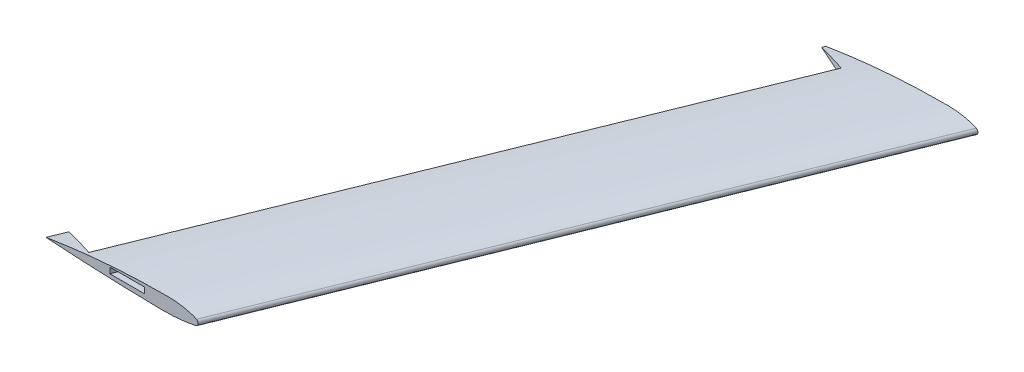
ISO-10303-21;
HEADER;
FILE_DESCRIPTION(('STEP AP214'),'2;1');
FILE_NAME('part.step','',(''),(''),'','','');
FILE_SCHEMA(('AUTOMOTIVE_DESIGN { 1 0 10303 214 1 1 1 1 }'));
ENDSEC;
DATA;
#1=APPLICATION_CONTEXT('core data for automotive mechanical design processes');
#2=APPLICATION_PROTOCOL_DEFINITION('international standard','automotive_design',2000,#1);
#3=PRODUCT_CONTEXT('',#1,'mechanical');
#4=PRODUCT('Part','Part','',(#3));
#5=PRODUCT_RELATED_PRODUCT_CATEGORY('part','',(#4));
#6=PRODUCT_DEFINITION_FORMATION('','',#4);
#7=PRODUCT_DEFINITION_CONTEXT('part definition',#1,'design');
#8=PRODUCT_DEFINITION('design','',#6,#7);
#9=PRODUCT_DEFINITION_SHAPE('','',#8);
#10=(LENGTH_UNIT() NAMED_UNIT(*) SI_UNIT(.MILLI.,.METRE.));
#11=(NAMED_UNIT(*) PLANE_ANGLE_UNIT() SI_UNIT($,.RADIAN.));
#12=(NAMED_UNIT(*) SI_UNIT($,.STERADIAN.) SOLID_ANGLE_UNIT());
#13=UNCERTAINTY_MEASURE_WITH_UNIT(LENGTH_MEASURE(1.E-05),#10,'distance_accuracy_value','');
#14=(GEOMETRIC_REPRESENTATION_CONTEXT(3) GLOBAL_UNCERTAINTY_ASSIGNED_CONTEXT((#13)) GLOBAL_UNIT_ASSIGNED_CONTEXT((#10,
#11,#12)) REPRESENTATION_CONTEXT('',''));
#15=CARTESIAN_POINT('',(0.,0.,0.));
#16=DIRECTION('',(0.,0.,1.));
#17=DIRECTION('',(1.,0.,0.));
#18=AXIS2_PLACEMENT_3D('',#15,#16,#17);
#19=CARTESIAN_POINT('',(-405.020409697345,-106.311961463395,1092.2));
#20=DIRECTION('',(0.,0.,-1.));
#21=DIRECTION('',(1.,0.,0.));
#22=AXIS2_PLACEMENT_3D('',#19,#20,#21);
#23=PLANE('',#22);
#24=DIRECTION('',(0.,1.,0.));
#25=VECTOR('',#24,1.);
#26=CARTESIAN_POINT('',(-520.129656428513,14.097,1092.2));
#27=LINE('',#26,#25);
#28=CARTESIAN_POINT('',(-520.129656428513,14.097,1092.2));
#29=VERTEX_POINT('',#28);
#30=CARTESIAN_POINT('',(-520.129656428513,25.527,1092.2));
#31=VERTEX_POINT('',#30);
#32=EDGE_CURVE('E430',#29,#31,#27,.T.);
#33=ORIENTED_EDGE('',*,*,#32,.T.);
#34=DIRECTION('',(-1.,0.,0.));
#35=VECTOR('',#34,1.);
#36=CARTESIAN_POINT('',(-520.129656428513,25.527,1092.2));
#37=LINE('',#36,#35);
#38=CARTESIAN_POINT('',(-451.642700268486,25.527,1092.2));
#39=VERTEX_POINT('',#38);
#40=EDGE_CURVE('E443',#39,#31,#37,.T.);
#41=ORIENTED_EDGE('',*,*,#40,.F.);
#42=DIRECTION('',(0.,1.,0.));
#43=VECTOR('',#42,1.);
#44=CARTESIAN_POINT('',(-451.642700268486,14.097,1092.2));
#45=LINE('',#44,#43);
#46=CARTESIAN_POINT('',(-451.642700268486,14.097,1092.2));
#47=VERTEX_POINT('',#46);
#48=EDGE_CURVE('E416',#47,#39,#45,.T.);
#49=ORIENTED_EDGE('',*,*,#48,.F.);
#50=DIRECTION('',(-1.,0.,0.));
#51=VECTOR('',#50,1.);
#52=CARTESIAN_POINT('',(-520.129656428513,14.097,1092.2));
#53=LINE('',#52,#51);
#54=EDGE_CURVE('E450',#47,#29,#53,.T.);
#55=ORIENTED_EDGE('',*,*,#54,.T.);
#56=EDGE_LOOP('',(#33,#41,#49,#55));
#57=FACE_BOUND('',#56,.T.);
#58=CARTESIAN_POINT('',(-375.48765869508,-20.0425810696087,1092.2));
#59=DIRECTION('',(0.,0.,1.));
#60=DIRECTION('',(1.,0.,0.));
#61=AXIS2_PLACEMENT_3D('',#58,#59,#60);
#62=ELLIPSE('',#61,52.0544729369289,48.2640668651051);
#63=CARTESIAN_POINT('',(-349.656597619421,21.8600320467453,1092.2));
#64=VERTEX_POINT('',#63);
#65=CARTESIAN_POINT('',(-359.739577110439,25.9598126997249,1092.2));
#66=VERTEX_POINT('',#65);
#67=EDGE_CURVE('E166',#64,#66,#62,.T.);
#68=ORIENTED_EDGE('',*,*,#67,.T.);
#69=CARTESIAN_POINT('',(-405.020409697345,-106.311961463395,1092.2));
#70=DIRECTION('',(0.,0.,1.));
#71=DIRECTION('',(1.,0.,0.));
#72=AXIS2_PLACEMENT_3D('',#69,#70,#71);
#73=ELLIPSE('',#72,149.673460972889,138.774816471194);
#74=CARTESIAN_POINT('',(-404.297033786117,32.4612342366972,1092.2));
#75=VERTEX_POINT('',#74);
#76=EDGE_CURVE('E335',#66,#75,#73,.T.);
#77=ORIENTED_EDGE('',*,*,#76,.T.);
#78=CARTESIAN_POINT('',(-410.785047423502,-1212.20612642052,1092.2));
#79=DIRECTION('',(0.,0.,1.));
#80=DIRECTION('',(1.,0.,0.));
#81=AXIS2_PLACEMENT_3D('',#78,#79,#80);
#82=ELLIPSE('',#81,1342.43267001044,1244.68189747666);
#83=CARTESIAN_POINT('',(-645.570996369339,13.291406219897,1092.2));
#84=VERTEX_POINT('',#83);
#85=EDGE_CURVE('E411',#75,#84,#82,.T.);
#86=ORIENTED_EDGE('',*,*,#85,.T.);
#87=CARTESIAN_POINT('',(-375.097020059196,2847.58690276896,1092.2));
#88=DIRECTION('',(0.,0.,1.));
#89=DIRECTION('',(0.999969321883776,-0.00783296184731892,0.));
#90=AXIS2_PLACEMENT_3D('',#87,#88,#89);
#91=ELLIPSE('',#90,3398.12195786294,2843.92729443399);
#92=CARTESIAN_POINT('',(-416.997552055502,3.94800461409561,1092.2));
#93=VERTEX_POINT('',#92);
#94=EDGE_CURVE('E156',#84,#93,#91,.T.);
#95=ORIENTED_EDGE('',*,*,#94,.T.);
#96=CARTESIAN_POINT('',(-413.099836229002,268.470372395264,1092.2));
#97=DIRECTION('',(0.,0.,1.));
#98=DIRECTION('',(1.,0.,0.));
#99=AXIS2_PLACEMENT_3D('',#96,#97,#98);
#100=ELLIPSE('',#99,285.323187882039,264.547053137752);
#101=CARTESIAN_POINT('',(-351.578401419046,10.1458611123359,1092.2));
#102=VERTEX_POINT('',#101);
#103=EDGE_CURVE('E404',#93,#102,#100,.T.);
#104=ORIENTED_EDGE('',*,*,#103,.T.);
#105=CARTESIAN_POINT('',(-353.055165161637,16.3468185510675,1092.2));
#106=DIRECTION('',(0.,0.,1.));
#107=DIRECTION('',(-1.,0.,0.));
#108=AXIS2_PLACEMENT_3D('',#105,#106,#107);
#109=ELLIPSE('',#108,6.84869408304132,6.35);
#110=EDGE_CURVE('E352',#64,#102,#109,.F.);
#111=ORIENTED_EDGE('',*,*,#110,.F.);
#112=EDGE_LOOP('',(#68,#77,#86,#95,#104,#111));
#113=FACE_BOUND('',#112,.T.);
#114=ADVANCED_FACE('F38',(#57,#113),#23,.F.);
#115=CARTESIAN_POINT('',(36.2563303026578,-106.311961463395,0.));
#116=DIRECTION('',(0.,0.,-1.));
#117=DIRECTION('',(1.,0.,0.));
#118=AXIS2_PLACEMENT_3D('',#115,#116,#117);
#119=PLANE('',#118);
#120=DIRECTION('',(1.,0.,0.));
#121=VECTOR('',#120,1.);
#122=CARTESIAN_POINT('',(-10.365256411322,14.097,0.));
#123=LINE('',#122,#121);
#124=CARTESIAN_POINT('',(-78.8522125713488,14.097,0.));
#125=VERTEX_POINT('',#124);
#126=CARTESIAN_POINT('',(-10.365256411322,14.097,0.));
#127=VERTEX_POINT('',#126);
#128=EDGE_CURVE('E434',#125,#127,#123,.T.);
#129=ORIENTED_EDGE('',*,*,#128,.T.);
#130=DIRECTION('',(0.,1.,0.));
#131=VECTOR('',#130,1.);
#132=CARTESIAN_POINT('',(-10.365256411322,14.097,0.));
#133=LINE('',#132,#131);
#134=CARTESIAN_POINT('',(-10.365256411322,25.527,0.));
#135=VERTEX_POINT('',#134);
#136=EDGE_CURVE('E418',#127,#135,#133,.T.);
#137=ORIENTED_EDGE('',*,*,#136,.T.);
#138=DIRECTION('',(1.,0.,0.));
#139=VECTOR('',#138,1.);
#140=CARTESIAN_POINT('',(-10.365256411322,25.527,0.));
#141=LINE('',#140,#139);
#142=CARTESIAN_POINT('',(-78.8522125713488,25.527,0.));
#143=VERTEX_POINT('',#142);
#144=EDGE_CURVE('E446',#143,#135,#141,.T.);
#145=ORIENTED_EDGE('',*,*,#144,.F.);
#146=DIRECTION('',(0.,1.,0.));
#147=VECTOR('',#146,1.);
#148=CARTESIAN_POINT('',(-78.8522125713488,14.097,0.));
#149=LINE('',#148,#147);
#150=EDGE_CURVE('E424',#125,#143,#149,.T.);
#151=ORIENTED_EDGE('',*,*,#150,.F.);
#152=EDGE_LOOP('',(#129,#137,#145,#151));
#153=FACE_BOUND('',#152,.T.);
#154=CARTESIAN_POINT('',(28.1769037710007,268.470372395264,0.));
#155=DIRECTION('',(0.,0.,1.));
#156=DIRECTION('',(1.,0.,0.));
#157=AXIS2_PLACEMENT_3D('',#154,#155,#156);
#158=ELLIPSE('',#157,285.323187882039,264.547053137752);
#159=CARTESIAN_POINT('',(24.2791879445013,3.9480046140925,0.));
#160=VERTEX_POINT('',#159);
#161=CARTESIAN_POINT('',(89.69834003348,10.1458541037797,0.));
#162=VERTEX_POINT('',#161);
#163=EDGE_CURVE('E366',#160,#162,#158,.T.);
#164=ORIENTED_EDGE('',*,*,#163,.F.);
#165=CARTESIAN_POINT('',(66.1797199408075,2847.58690276896,0.));
#166=DIRECTION('',(0.,0.,1.));
#167=DIRECTION('',(0.999969321883776,-0.00783296184731892,0.));
#168=AXIS2_PLACEMENT_3D('',#165,#166,#167);
#169=ELLIPSE('',#168,3398.12195786294,2843.927294434);
#170=CARTESIAN_POINT('',(-204.294256369335,13.2914062198952,0.));
#171=VERTEX_POINT('',#170);
#172=EDGE_CURVE('E370',#171,#160,#169,.T.);
#173=ORIENTED_EDGE('',*,*,#172,.F.);
#174=CARTESIAN_POINT('',(30.4916925765012,-1212.20612642052,0.));
#175=DIRECTION('',(0.,0.,1.));
#176=DIRECTION('',(1.,0.,0.));
#177=AXIS2_PLACEMENT_3D('',#174,#175,#176);
#178=ELLIPSE('',#177,1342.43267001044,1244.68189747666);
#179=CARTESIAN_POINT('',(36.9797062138845,32.4612342366976,0.));
#180=VERTEX_POINT('',#179);
#181=EDGE_CURVE('E185',#180,#171,#178,.T.);
#182=ORIENTED_EDGE('',*,*,#181,.F.);
#183=CARTESIAN_POINT('',(36.2563303026578,-106.311961463395,0.));
#184=DIRECTION('',(0.,0.,1.));
#185=DIRECTION('',(1.,0.,0.));
#186=AXIS2_PLACEMENT_3D('',#183,#184,#185);
#187=ELLIPSE('',#186,149.673460972889,138.774816471194);
#188=CARTESIAN_POINT('',(81.5371628895645,25.9598126997247,0.));
#189=VERTEX_POINT('',#188);
#190=EDGE_CURVE('E164',#189,#180,#187,.T.);
#191=ORIENTED_EDGE('',*,*,#190,.F.);
#192=CARTESIAN_POINT('',(65.7890813049233,-20.042581069609,0.));
#193=DIRECTION('',(0.,0.,1.));
#194=DIRECTION('',(1.,0.,0.));
#195=AXIS2_PLACEMENT_3D('',#192,#193,#194);
#196=ELLIPSE('',#195,52.0544729369298,48.264066865105);
#197=CARTESIAN_POINT('',(91.6201507247673,21.8600477382464,0.));
#198=VERTEX_POINT('',#197);
#199=EDGE_CURVE('E345',#198,#189,#196,.T.);
#200=ORIENTED_EDGE('',*,*,#199,.F.);
#201=CARTESIAN_POINT('',(88.2215748383678,16.3468185510675,0.));
#202=DIRECTION('',(0.,0.,1.));
#203=DIRECTION('',(-1.,0.,0.));
#204=AXIS2_PLACEMENT_3D('',#201,#202,#203);
#205=ELLIPSE('',#204,6.84869408304132,6.35);
#206=EDGE_CURVE('E143',#162,#198,#205,.T.);
#207=ORIENTED_EDGE('',*,*,#206,.F.);
#208=EDGE_LOOP('',(#164,#173,#182,#191,#200,#207));
#209=FACE_BOUND('',#208,.T.);
#210=ADVANCED_FACE('F253',(#153,#209),#119,.T.);
#211=CARTESIAN_POINT('',(24.2791879445013,3.9480046140925,0.));
#212=CARTESIAN_POINT('',(-416.997552055502,3.94800461409517,1092.2));
#213=CARTESIAN_POINT('',(-52.1815592124826,4.91654565789146,0.));
#214=CARTESIAN_POINT('',(-493.458299212486,4.91654565789368,1092.2));
#215=CARTESIAN_POINT('',(-128.070307753034,8.01865166633231,0.));
#216=CARTESIAN_POINT('',(-569.347047753037,8.01865166633497,1092.2));
#217=CARTESIAN_POINT('',(-204.294256369335,13.2914062198952,0.));
#218=CARTESIAN_POINT('',(-645.570996369338,13.2914062198979,1092.2));
#219=B_SPLINE_SURFACE_WITH_KNOTS('',3,1,((#211,#212),(#213,#214),(#215,#216),(#217,#218)),
.UNSPECIFIED.,.F.,.F.,.F.,(4,4),(2,2),(0.,1.),(0.,1.),.UNSPECIFIED.);
#220=CARTESIAN_POINT('',(-126.036881012646,7.89112834777585,38.4666756600021));
#221=CARTESIAN_POINT('',(-128.278484905039,8.01092148253035,37.56101034412));
#222=CARTESIAN_POINT('',(-130.519972721928,8.13324110956644,36.6553919257108));
#223=CARTESIAN_POINT('',(-135.002657877712,8.38292784613941,34.8442724494329));
#224=CARTESIAN_POINT('',(-137.243855221856,8.51029484604702,33.9387713894432));
#225=CARTESIAN_POINT('',(-141.725959561278,8.77007377482888,32.1278865778336));
#226=CARTESIAN_POINT('',(-143.966866560917,8.90248561617044,31.2225028244516));
#227=CARTESIAN_POINT('',(-148.448390381219,9.1723509375326,29.4118525574168));
#228=CARTESIAN_POINT('',(-150.689007205273,9.30980435206728,28.5065860423943));
#229=CARTESIAN_POINT('',(-155.169950870303,9.58974901572337,26.6961701729309));
#230=CARTESIAN_POINT('',(-157.410277713615,9.73224022133346,25.7910208175458));
#231=CARTESIAN_POINT('',(-161.890641642914,10.0222560917135,23.9808391761481));
#232=CARTESIAN_POINT('',(-164.130678730104,10.1697807348575,23.0758068896492));
#233=CARTESIAN_POINT('',(-168.610463042553,10.4698585278008,21.2658594282861));
#234=CARTESIAN_POINT('',(-170.850210267851,10.6224116769461,20.3609442534066));
#235=CARTESIAN_POINT('',(-175.329415543471,10.9325410229769,18.551230737735));
#236=CARTESIAN_POINT('',(-177.56887359249,11.0901172417668,17.6464323974695));
#237=CARTESIAN_POINT('',(-182.047500896621,11.4102866997795,15.836952397065));
#238=CARTESIAN_POINT('',(-184.286670149055,11.572879982573,14.9322707380079));
#239=CARTESIAN_POINT('',(-188.7647202776,11.9030769817785,13.123023931305));
#240=CARTESIAN_POINT('',(-191.003601149585,12.0706807632816,12.2184587853263));
#241=CARTESIAN_POINT('',(-195.481074963012,12.4108916731137,10.4094448246738));
#242=CARTESIAN_POINT('',(-197.719667898807,12.5834988878922,9.50499601228162));
#243=CARTESIAN_POINT('',(-202.196566343884,12.933708871203,7.69621451516155));
#244=CARTESIAN_POINT('',(-204.434871845928,13.1113117473604,6.79188183335784));
#245=CARTESIAN_POINT('',(-206.673004975753,13.2914062198952,5.8876187943401));
#246=B_SPLINE_CURVE_WITH_KNOTS('',3,(#220,#221,#222,#223,#224,#225,#226,#227,#228,#229,#230,
#231,#232,#233,#234,#235,#236,#237,#238,#239,#240,#241,#242,#243,#244,#245),.UNSPECIFIED.,.F.,
.F.,(4,2,2,2,2,2,2,2,2,2,2,2,4),(0.,7.26183815057946,14.5235186599017,21.7850732296287,
29.046533511072,36.3079310907253,43.5692974758774,50.8306629164956,58.0920600267757,
65.3535202166234,72.6150747808706,79.8767548853967,87.1385915534071),.UNSPECIFIED.);
#247=CARTESIAN_POINT('',(-139.521830314049,8.64232456029368,33.0184111784157));
#248=VERTEX_POINT('',#247);
#249=CARTESIAN_POINT('',(-206.673004975752,13.2914062198969,5.88761879434033));
#250=VERTEX_POINT('',#249);
#251=EDGE_CURVE('E445',#248,#250,#246,.T.);
#252=DIRECTION('',(-0.374606079750782,0.,0.927184062100806));
#253=VECTOR('',#252,1.);
#254=CARTESIAN_POINT('',(-424.932626369337,13.2914062198966,546.1));
#255=LINE('',#254,#253);
#256=EDGE_CURVE('E159',#171,#250,#255,.T.);
#257=DIRECTION('',(0.374606079750782,0.,-0.927184062100806));
#258=VECTOR('',#257,1.);
#259=CARTESIAN_POINT('',(-196.3591820555,3.94800461409384,546.1));
#260=LINE('',#259,#258);
#261=EDGE_CURVE('E160',#93,#160,#260,.T.);
#262=CARTESIAN_POINT('',(-632.469005524479,13.291406219897,1059.77138298122));
#263=VERTEX_POINT('',#262);
#264=EDGE_CURVE('E140',#263,#84,#255,.T.);
#265=CARTESIAN_POINT('',(-632.469005524479,13.2914062198978,1059.77138298122));
#266=CARTESIAN_POINT('',(-630.241200754864,13.1121428346697,1060.6714730985));
#267=CARTESIAN_POINT('',(-628.013225200546,12.9353481008424,1061.57163221717));
#268=CARTESIAN_POINT('',(-623.556989033889,12.5867083429094,1063.37206562524));
#269=CARTESIAN_POINT('',(-621.328728428655,12.4148632131565,1064.27233991177));
#270=CARTESIAN_POINT('',(-616.871921665739,12.0761303122216,1066.07300385532));
#271=CARTESIAN_POINT('',(-614.643375513602,11.90924245618,1066.9733935101));
#272=CARTESIAN_POINT('',(-610.185997219515,11.5804310578732,1068.77428836687));
#273=CARTESIAN_POINT('',(-607.957165081617,11.4185074517147,1069.67479356722));
#274=CARTESIAN_POINT('',(-603.499214406192,11.0996310173006,1071.47591968069));
#275=CARTESIAN_POINT('',(-601.270095871293,10.9426781462762,1072.37654059275));
#276=CARTESIAN_POINT('',(-596.811572027761,10.6337490967834,1074.1778982808));
#277=CARTESIAN_POINT('',(-594.582166720408,10.4817728968137,1075.07863505627));
#278=CARTESIAN_POINT('',(-590.123068656354,10.182802544329,1076.8802247441));
#279=CARTESIAN_POINT('',(-587.893375899616,10.0358083924553,1077.78107765647));
#280=CARTESIAN_POINT('',(-583.43370304036,9.74680699733439,1079.58289957626));
#281=CARTESIAN_POINT('',(-581.203722936659,9.60479977531541,1080.48386858416));
#282=CARTESIAN_POINT('',(-576.743475161636,9.32577653277055,1082.28592278463));
#283=CARTESIAN_POINT('',(-574.513207488018,9.18876055495496,1083.18700797813));
#284=CARTESIAN_POINT('',(-570.052384380514,8.91972353272654,1084.98929462764));
#285=CARTESIAN_POINT('',(-567.821828943295,8.78770255259393,1085.890496085));
#286=CARTESIAN_POINT('',(-563.360430141336,8.52865875318313,1087.6930153298));
#287=CARTESIAN_POINT('',(-561.129586772307,8.40163601982619,1088.59433311897));
#288=CARTESIAN_POINT('',(-556.667611979433,8.15259121816209,1090.39708507884));
#289=CARTESIAN_POINT('',(-554.436480550424,8.03056925746657,1091.29851925161));
#290=CARTESIAN_POINT('',(-552.205233848085,7.91105046857443,1092.19999999776));
#291=B_SPLINE_CURVE_WITH_KNOTS('',3,(#265,#266,#267,#268,#269,#270,#271,#272,#273,#274,#275,
#276,#277,#278,#279,#280,#281,#282,#283,#284,#285,#286,#287,#288,#289,#290),.UNSPECIFIED.,.F.,
.F.,(4,2,2,2,2,2,2,2,2,2,2,2,4),(0.,7.2283253281298,14.4564962563039,21.6845433798499,
28.9124974342535,36.1403892817526,43.3682498977786,50.596111444078,57.8240037538657,
65.0519578984833,72.2800050274255,79.5081763542844,86.7365031426151),.UNSPECIFIED.);
#292=CARTESIAN_POINT('',(-565.317830862776,8.64232456029626,1086.9021753653));
#293=VERTEX_POINT('',#292);
#294=EDGE_CURVE('E146',#263,#293,#291,.T.);
#295=DIRECTION('',(-0.374606079750782,0.,0.927184062100806));
#296=VECTOR('',#295,1.);
#297=CARTESIAN_POINT('',(-346.819917540941,8.64232456029495,546.1));
#298=LINE('',#297,#296);
#299=EDGE_CURVE('E150',#293,#248,#298,.F.);
#300=ORIENTED_EDGE('',*,*,#251,.T.);
#301=ORIENTED_EDGE('',*,*,#256,.F.);
#302=ORIENTED_EDGE('',*,*,#172,.T.);
#303=ORIENTED_EDGE('',*,*,#261,.F.);
#304=ORIENTED_EDGE('',*,*,#94,.F.);
#305=ORIENTED_EDGE('',*,*,#264,.F.);
#306=ORIENTED_EDGE('',*,*,#294,.T.);
#307=ORIENTED_EDGE('',*,*,#299,.T.);
#308=EDGE_LOOP('',(#300,#301,#302,#303,#304,#305,#306,#307));
#309=FACE_BOUND('',#308,.T.);
#310=ADVANCED_FACE('F154',(#309),#219,.F.);
#311=CARTESIAN_POINT('',(-204.294256369334,13.291406219897,0.));
#312=CARTESIAN_POINT('',(-645.570996369339,13.291406219897,1092.2));
#313=CARTESIAN_POINT('',(-184.369512206068,16.5729948319006,0.));
#314=CARTESIAN_POINT('',(-625.646252206072,16.5729948319006,1092.2));
#315=CARTESIAN_POINT('',(-144.381846874478,22.2970469233992,0.));
#316=CARTESIAN_POINT('',(-585.658586874481,22.2970469233992,1092.2));
#317=CARTESIAN_POINT('',(-84.0928808529997,28.3577961129315,0.));
#318=CARTESIAN_POINT('',(-525.369620853004,28.3577961129318,1092.2));
#319=CARTESIAN_POINT('',(-23.6029921881773,31.8877488147466,0.));
#320=CARTESIAN_POINT('',(-464.879732188181,31.8877488147467,1092.2));
#321=CARTESIAN_POINT('',(16.786735512809,32.5517221116263,0.));
#322=CARTESIAN_POINT('',(-424.490004487194,32.5517221116265,1092.2));
#323=CARTESIAN_POINT('',(40.7445311666091,32.4443634644624,0.));
#324=CARTESIAN_POINT('',(-400.532208833394,32.4443634644627,1092.2));
#325=CARTESIAN_POINT('',(48.2730020239182,32.1471592514172,0.));
#326=CARTESIAN_POINT('',(-393.003737976084,32.1471592514174,1092.2));
#327=CARTESIAN_POINT('',(59.506847478084,30.9120471491535,0.));
#328=CARTESIAN_POINT('',(-381.76989252192,30.9120471491538,1092.2));
#329=CARTESIAN_POINT('',(70.6262351500064,28.8907943172392,0.));
#330=CARTESIAN_POINT('',(-370.650504849996,28.8907943172394,1092.2));
#331=CARTESIAN_POINT('',(77.9254542807245,27.0227108474497,0.));
#332=CARTESIAN_POINT('',(-363.351285719279,27.0227108474499,1092.2));
#333=CARTESIAN_POINT('',(83.5793832108858,25.3588029196259,0.));
#334=CARTESIAN_POINT('',(-357.697356789117,25.3588029196261,1092.2));
#335=CARTESIAN_POINT('',(87.5941757429644,23.9197561714356,0.));
#336=CARTESIAN_POINT('',(-353.682564257038,23.9197561714358,1092.2));
#337=CARTESIAN_POINT('',(93.3207247398045,21.0668713918343,0.));
#338=CARTESIAN_POINT('',(-347.956015260199,21.0668713918345,1092.2));
#339=CARTESIAN_POINT('',(98.6625260073383,17.5448620789614,0.));
#340=CARTESIAN_POINT('',(-342.614213992664,17.5448620789614,1092.2));
#341=CARTESIAN_POINT('',(101.906485619259,14.7742785920445,0.));
#342=CARTESIAN_POINT('',(-339.370254380744,14.7742785920445,1092.2));
#343=CARTESIAN_POINT('',(103.43389064888,13.291406219897,0.));
#344=CARTESIAN_POINT('',(-337.842849351123,13.2914062198969,1092.2));
#345=B_SPLINE_SURFACE_WITH_KNOTS('',3,1,((#311,#312),(#313,#314),(#315,#316),(#317,#318),(#319,
#320),(#321,#322),(#323,#324),(#325,#326),(#327,#328),(#329,#330),(#331,#332),(#333,#334),(#335,
#336),(#337,#338),(#339,#340),(#341,#342),(#343,#344)),.UNSPECIFIED.,.F.,.F.,.F.,(4,1,1,1,2,1,1,
1,2,1,1,1,4),(2,2),(0.,0.193518652711467,0.387037305422934,0.580555958134401,0.774074610845868,
0.81015468362618,0.846234756406491,0.882314829186803,0.918394901967115,0.938796176475336,
0.959197450983557,0.979598725491779,1.),(0.,1.),.UNSPECIFIED.);
#346=CARTESIAN_POINT('',(-206.673004975752,13.291406219897,5.88761879434041));
#347=CARTESIAN_POINT('',(-204.444516867048,13.7183491625754,6.78798499809211));
#348=CARTESIAN_POINT('',(-202.214864114656,14.1382207345731,7.68882174768713));
#349=CARTESIAN_POINT('',(-197.753692459223,14.9637361411322,9.49124921947812));
#350=CARTESIAN_POINT('',(-195.522173945612,15.3693824237515,10.3928397843343));
#351=CARTESIAN_POINT('',(-191.057271900483,16.1664548019713,12.1967744289905));
#352=CARTESIAN_POINT('',(-188.823888669683,16.5578828570464,13.0991183872934));
#353=CARTESIAN_POINT('',(-184.355258075826,17.326524709678,14.9045594610173));
#354=CARTESIAN_POINT('',(-182.120010930232,17.7037399778571,15.8076564885782));
#355=CARTESIAN_POINT('',(-177.647653134601,18.4439604766612,17.6146034471663));
#356=CARTESIAN_POINT('',(-175.410542624188,18.8069666885976,18.5184533217814));
#357=CARTESIAN_POINT('',(-170.934458470211,19.518771596489,20.3269058244663));
#358=CARTESIAN_POINT('',(-168.695484893817,19.8675707837774,21.2315084253979));
#359=CARTESIAN_POINT('',(-164.215674624868,20.5509625249232,23.0414663738508));
#360=CARTESIAN_POINT('',(-161.974837932291,20.8855550786075,23.9468217213814));
#361=CARTESIAN_POINT('',(-157.491301282578,21.5405325703131,25.7582852229891));
#362=CARTESIAN_POINT('',(-155.248601263646,21.8609170162661,26.6643934020335));
#363=CARTESIAN_POINT('',(-150.761337725154,22.4874762168824,28.4773626620468));
#364=CARTESIAN_POINT('',(-148.516774087402,22.7936499869095,29.3842237907684));
#365=CARTESIAN_POINT('',(-144.025783040453,23.39178550689,31.1986990595532));
#366=CARTESIAN_POINT('',(-141.779355462022,23.6837457787629,32.1063132679913));
#367=CARTESIAN_POINT('',(-137.284636031435,24.2534500282937,33.9222948991434));
#368=CARTESIAN_POINT('',(-135.036343964338,24.5311920333521,34.8306624086987));
#369=CARTESIAN_POINT('',(-130.537894868671,25.0724539093709,36.6481509199529));
#370=CARTESIAN_POINT('',(-128.287737584781,25.3359713119754,37.5572720248076));
#371=CARTESIAN_POINT('',(-126.036881012646,25.5923471267548,38.4666756600021));
#372=B_SPLINE_CURVE_WITH_KNOTS('',3,(#346,#347,#348,#349,#350,#351,#352,#353,#354,#355,#356,
#357,#358,#359,#360,#361,#362,#363,#364,#365,#366,#367,#368,#369,#370,#371),.UNSPECIFIED.,.F.,
.F.,(4,2,2,2,2,2,2,2,2,2,2,2,4),(0.,7.32336907296897,14.6454716058275,21.9665611901147,
29.2868911560357,36.6067146672221,43.9262848154858,51.2458550529572,58.5656785908067,
65.8860085532753,73.2070981475906,80.5292007103939,87.8525697996426),.UNSPECIFIED.);
#373=CARTESIAN_POINT('',(-141.593921376181,23.7052214247266,32.1812333823336));
#374=VERTEX_POINT('',#373);
#375=EDGE_CURVE('E11',#250,#374,#372,.T.);
#376=DIRECTION('',(-0.374606079750783,0.,0.927184062100805));
#377=VECTOR('',#376,1.);
#378=CARTESIAN_POINT('',(-349.230249848866,23.7052214247266,546.1));
#379=LINE('',#378,#377);
#380=CARTESIAN_POINT('',(-567.389921924935,23.7052214247233,1086.0649975692));
#381=VERTEX_POINT('',#380);
#382=EDGE_CURVE('E47',#374,#381,#379,.T.);
#383=CARTESIAN_POINT('',(-552.205233842538,25.5498697826938,1092.2));
#384=CARTESIAN_POINT('',(-554.44566043982,25.2938892249827,1091.29481034146));
#385=CARTESIAN_POINT('',(-556.685392038796,25.0308328710358,1090.38990148001));
#386=CARTESIAN_POINT('',(-561.163004768393,24.4906240420101,1088.58083139368));
#387=CARTESIAN_POINT('',(-563.400886150339,24.2134739901285,1087.67667006724));
#388=CARTESIAN_POINT('',(-567.874799200666,23.6450844603998,1085.86909474597));
#389=CARTESIAN_POINT('',(-570.110831080548,23.3538469190745,1084.96568066568));
#390=CARTESIAN_POINT('',(-574.581045709328,22.7572875644266,1083.15959960133));
#391=CARTESIAN_POINT('',(-576.815228624697,22.451967202157,1082.25693255));
#392=CARTESIAN_POINT('',(-581.281745690444,21.8272454548954,1080.4523453957));
#393=CARTESIAN_POINT('',(-583.51407995705,21.5078450365358,1079.55042524577));
#394=CARTESIAN_POINT('',(-587.976900075665,20.8549662428089,1077.74733175268));
#395=CARTESIAN_POINT('',(-590.207385988426,20.5214883505112,1076.84615838498));
#396=CARTESIAN_POINT('',(-594.666509664223,19.8404565220647,1075.04455834936));
#397=CARTESIAN_POINT('',(-596.895147427282,19.4929025860871,1074.14413168142));
#398=CARTESIAN_POINT('',(-601.35057491906,18.7837187685149,1072.34402499869));
#399=CARTESIAN_POINT('',(-603.577364581776,18.4220884045685,1071.44434501056));
#400=CARTESIAN_POINT('',(-608.029095649827,17.6847502128619,1069.64573177758));
#401=CARTESIAN_POINT('',(-610.25403691799,17.3090414217226,1068.74679858814));
#402=CARTESIAN_POINT('',(-614.702070732612,16.5435431899798,1066.94967914012));
#403=CARTESIAN_POINT('',(-616.925163065473,16.1537523056223,1066.05149296784));
#404=CARTESIAN_POINT('',(-621.369498302496,15.3600850222991,1064.25586783978));
#405=CARTESIAN_POINT('',(-623.590740911337,14.9562066996552,1063.35842900333));
#406=CARTESIAN_POINT('',(-628.031375761326,14.1343580829071,1061.5642989263));
#407=CARTESIAN_POINT('',(-630.250767620096,13.7163853854659,1060.66760784021));
#408=CARTESIAN_POINT('',(-632.469005524479,13.291406219897,1059.77138298122));
#409=B_SPLINE_CURVE_WITH_KNOTS('',3,(#383,#384,#385,#386,#387,#388,#389,#390,#391,#392,#393,
#394,#395,#396,#397,#398,#399,#400,#401,#402,#403,#404,#405,#406,#407,#408),.UNSPECIFIED.,.F.,
.F.,(4,2,2,2,2,2,2,2,2,2,2,2,4),(0.,7.28968445239368,14.5781197643517,21.8655560107772,
29.1522430509077,36.43843061771,43.7243683613861,51.0103060164494,58.2964935561986,
65.5831805996182,72.8706168360787,80.1590521179341,87.4487365531201),.UNSPECIFIED.);
#410=EDGE_CURVE('E136',#381,#263,#409,.T.);
#411=DIRECTION('',(-0.374606079750783,0.,0.927184062100805));
#412=VECTOR('',#411,1.);
#413=CARTESIAN_POINT('',(91.6200506668931,21.8598594039577,0.));
#414=LINE('',#413,#412);
#415=EDGE_CURVE('E350',#198,#64,#414,.T.);
#416=ORIENTED_EDGE('',*,*,#375,.T.);
#417=ORIENTED_EDGE('',*,*,#382,.T.);
#418=ORIENTED_EDGE('',*,*,#410,.T.);
#419=ORIENTED_EDGE('',*,*,#264,.T.);
#420=ORIENTED_EDGE('',*,*,#85,.F.);
#421=ORIENTED_EDGE('',*,*,#76,.F.);
#422=ORIENTED_EDGE('',*,*,#67,.F.);
#423=ORIENTED_EDGE('',*,*,#415,.F.);
#424=ORIENTED_EDGE('',*,*,#199,.T.);
#425=ORIENTED_EDGE('',*,*,#190,.T.);
#426=ORIENTED_EDGE('',*,*,#181,.T.);
#427=ORIENTED_EDGE('',*,*,#256,.T.);
#428=EDGE_LOOP('',(#416,#417,#418,#419,#420,#421,#422,#423,#424,#425,#426,#427));
#429=FACE_BOUND('',#428,.T.);
#430=ADVANCED_FACE('F138',(#429),#345,.F.);
#431=CARTESIAN_POINT('',(103.43389064888,13.2914062198967,0.));
#432=CARTESIAN_POINT('',(-337.842849351123,13.2914062198969,1092.2));
#433=CARTESIAN_POINT('',(77.651903074527,6.75483393441806,0.));
#434=CARTESIAN_POINT('',(-363.624836925476,6.75483393441834,1092.2));
#435=CARTESIAN_POINT('',(51.0051853944075,3.60946194443507,0.));
#436=CARTESIAN_POINT('',(-390.271554605596,3.60946194443529,1092.2));
#437=CARTESIAN_POINT('',(24.2791879445013,3.94800461409456,0.));
#438=CARTESIAN_POINT('',(-416.997552055502,3.94800461409478,1092.2));
#439=B_SPLINE_SURFACE_WITH_KNOTS('',3,1,((#431,#432),(#433,#434),(#435,#436),(#437,#438)),
.UNSPECIFIED.,.F.,.F.,.F.,(4,4),(2,2),(0.,1.),(0.,1.),.UNSPECIFIED.);
#440=DIRECTION('',(-0.374606079750782,0.,0.927184062100806));
#441=VECTOR('',#440,1.);
#442=CARTESIAN_POINT('',(-351.57846750198,10.1461837410461,1092.2));
#443=LINE('',#442,#441);
#444=EDGE_CURVE('E358',#102,#162,#443,.F.);
#445=ORIENTED_EDGE('',*,*,#103,.F.);
#446=ORIENTED_EDGE('',*,*,#261,.T.);
#447=ORIENTED_EDGE('',*,*,#163,.T.);
#448=ORIENTED_EDGE('',*,*,#444,.F.);
#449=EDGE_LOOP('',(#445,#446,#447,#448));
#450=FACE_BOUND('',#449,.T.);
#451=ADVANCED_FACE('F202',(#450),#439,.F.);
#452=CARTESIAN_POINT('',(-130.282055219664,16.3468185510675,540.81632480647));
#453=DIRECTION('',(-0.374606079750783,0.,0.927184062100805));
#454=DIRECTION('',(-0.927184062100806,0.,-0.374606079750783));
#455=AXIS2_PLACEMENT_3D('',#452,#453,#454);
#456=CYLINDRICAL_SURFACE('',#455,6.35);
#457=ORIENTED_EDGE('',*,*,#206,.T.);
#458=ORIENTED_EDGE('',*,*,#415,.T.);
#459=ORIENTED_EDGE('',*,*,#110,.T.);
#460=ORIENTED_EDGE('',*,*,#444,.T.);
#461=EDGE_LOOP('',(#457,#458,#459,#460));
#462=FACE_BOUND('',#461,.T.);
#463=ADVANCED_FACE('F40',(#462),#456,.T.);
#464=CARTESIAN_POINT('',(-451.642700268486,14.097,1092.2));
#465=DIRECTION('',(0.927183854566786,0.,0.374606593415916));
#466=DIRECTION('',(-0.374606593415916,0.,0.927183854566786));
#467=AXIS2_PLACEMENT_3D('',#464,#465,#466);
#468=PLANE('',#467);
#469=DIRECTION('',(-0.374606593415916,0.,0.927183854566786));
#470=VECTOR('',#469,1.);
#471=CARTESIAN_POINT('',(-451.642700268486,25.527,1092.2));
#472=LINE('',#471,#470);
#473=EDGE_CURVE('E427',#135,#39,#472,.T.);
#474=ORIENTED_EDGE('',*,*,#473,.F.);
#475=ORIENTED_EDGE('',*,*,#136,.F.);
#476=DIRECTION('',(-0.374606593415916,0.,0.927183854566786));
#477=VECTOR('',#476,1.);
#478=CARTESIAN_POINT('',(-451.642700268486,14.097,1092.2));
#479=LINE('',#478,#477);
#480=EDGE_CURVE('E432',#127,#47,#479,.T.);
#481=ORIENTED_EDGE('',*,*,#480,.T.);
#482=ORIENTED_EDGE('',*,*,#48,.T.);
#483=EDGE_LOOP('',(#474,#475,#481,#482));
#484=FACE_BOUND('',#483,.T.);
#485=ADVANCED_FACE('F483',(#484),#468,.F.);
#486=CARTESIAN_POINT('',(-78.8522125713488,14.097,0.));
#487=DIRECTION('',(-0.927183854566786,0.,-0.374606593415916));
#488=DIRECTION('',(0.374606593415916,0.,-0.927183854566786));
#489=AXIS2_PLACEMENT_3D('',#486,#487,#488);
#490=PLANE('',#489);
#491=DIRECTION('',(0.374606593415916,0.,-0.927183854566786));
#492=VECTOR('',#491,1.);
#493=CARTESIAN_POINT('',(-78.8522125713488,25.527,0.));
#494=LINE('',#493,#492);
#495=EDGE_CURVE('E63',#31,#143,#494,.T.);
#496=ORIENTED_EDGE('',*,*,#495,.F.);
#497=ORIENTED_EDGE('',*,*,#32,.F.);
#498=DIRECTION('',(0.374606593415916,0.,-0.927183854566786));
#499=VECTOR('',#498,1.);
#500=CARTESIAN_POINT('',(-78.8522125713488,14.097,0.));
#501=LINE('',#500,#499);
#502=EDGE_CURVE('E439',#29,#125,#501,.T.);
#503=ORIENTED_EDGE('',*,*,#502,.T.);
#504=ORIENTED_EDGE('',*,*,#150,.T.);
#505=EDGE_LOOP('',(#496,#497,#503,#504));
#506=FACE_BOUND('',#505,.T.);
#507=ADVANCED_FACE('F263',(#506),#490,.F.);
#508=CARTESIAN_POINT('',(0.,14.097,0.));
#509=DIRECTION('',(0.,-1.,0.));
#510=DIRECTION('',(0.,0.,1.));
#511=AXIS2_PLACEMENT_3D('',#508,#509,#510);
#512=PLANE('',#511);
#513=ORIENTED_EDGE('',*,*,#54,.F.);
#514=ORIENTED_EDGE('',*,*,#480,.F.);
#515=ORIENTED_EDGE('',*,*,#128,.F.);
#516=ORIENTED_EDGE('',*,*,#502,.F.);
#517=EDGE_LOOP('',(#513,#514,#515,#516));
#518=FACE_BOUND('',#517,.T.);
#519=ADVANCED_FACE('F467',(#518),#512,.F.);
#520=CARTESIAN_POINT('',(0.,25.527,0.));
#521=DIRECTION('',(0.,-1.,0.));
#522=DIRECTION('',(0.,0.,1.));
#523=AXIS2_PLACEMENT_3D('',#520,#521,#522);
#524=PLANE('',#523);
#525=ORIENTED_EDGE('',*,*,#40,.T.);
#526=ORIENTED_EDGE('',*,*,#495,.T.);
#527=ORIENTED_EDGE('',*,*,#144,.T.);
#528=ORIENTED_EDGE('',*,*,#473,.T.);
#529=EDGE_LOOP('',(#525,#526,#527,#528));
#530=FACE_BOUND('',#529,.T.);
#531=ADVANCED_FACE('F463',(#530),#524,.T.);
#532=CARTESIAN_POINT('',(-217.449435904862,91.629791350905,1.53366502283972));
#533=DIRECTION('',(0.374606079750782,0.,-0.927184062100806));
#534=DIRECTION('',(0.927184062100806,0.,0.374606079750782));
#535=AXIS2_PLACEMENT_3D('',#532,#533,#534);
#536=PLANE('',#535);
#537=ORIENTED_EDGE('',*,*,#251,.F.);
#538=DIRECTION('',(0.136073087094658,-0.98917220115917,0.0549770081256818));
#539=VECTOR('',#538,1.);
#540=CARTESIAN_POINT('',(-152.370352246088,102.043606125362,27.8272796347528));
#541=LINE('',#540,#539);
#542=EDGE_CURVE('E151',#374,#248,#541,.T.);
#543=ORIENTED_EDGE('',*,*,#542,.F.);
#544=ORIENTED_EDGE('',*,*,#375,.F.);
#545=EDGE_LOOP('',(#537,#543,#544));
#546=FACE_BOUND('',#545,.T.);
#547=ADVANCED_FACE('F458',(#546),#536,.F.);
#548=CARTESIAN_POINT('',(-152.370352246088,102.043606125362,27.8272796347528));
#549=DIRECTION('',(0.917144699587955,0.14675951912541,0.370549920474688));
#550=DIRECTION('',(-0.374606079750782,0.,0.927184062100806));
#551=AXIS2_PLACEMENT_3D('',#548,#549,#550);
#552=PLANE('',#551);
#553=ORIENTED_EDGE('',*,*,#299,.F.);
#554=DIRECTION('',(0.136073087094658,-0.98917220115917,0.0549770081256818));
#555=VECTOR('',#554,1.);
#556=CARTESIAN_POINT('',(-578.166352794814,102.043606125365,1081.71104382163));
#557=LINE('',#556,#555);
#558=EDGE_CURVE('E55',#381,#293,#557,.T.);
#559=ORIENTED_EDGE('',*,*,#558,.F.);
#560=ORIENTED_EDGE('',*,*,#382,.F.);
#561=ORIENTED_EDGE('',*,*,#542,.T.);
#562=EDGE_LOOP('',(#553,#559,#560,#561));
#563=FACE_BOUND('',#562,.T.);
#564=ADVANCED_FACE('F462',(#563),#552,.F.);
#565=CARTESIAN_POINT('',(-643.245436453588,91.6297913509076,1055.41742920972));
#566=DIRECTION('',(-0.374606079750779,0.,0.927184062100807));
#567=DIRECTION('',(-0.927184062100807,0.,-0.374606079750779));
#568=AXIS2_PLACEMENT_3D('',#565,#566,#567);
#569=PLANE('',#568);
#570=ORIENTED_EDGE('',*,*,#294,.F.);
#571=ORIENTED_EDGE('',*,*,#410,.F.);
#572=ORIENTED_EDGE('',*,*,#558,.T.);
#573=EDGE_LOOP('',(#570,#571,#572));
#574=FACE_BOUND('',#573,.T.);
#575=ADVANCED_FACE('F147',(#574),#569,.F.);
#576=CLOSED_SHELL('',(#114,#210,#310,#430,#451,#463,#485,#507,#519,#531,#547,#564,#575));
#577=MANIFOLD_SOLID_BREP('B2',#576);
#578=ADVANCED_BREP_SHAPE_REPRESENTATION('',(#18,#577),#14);
#579=SHAPE_DEFINITION_REPRESENTATION(#9,#578);
ENDSEC;
END-ISO-10303-21;
